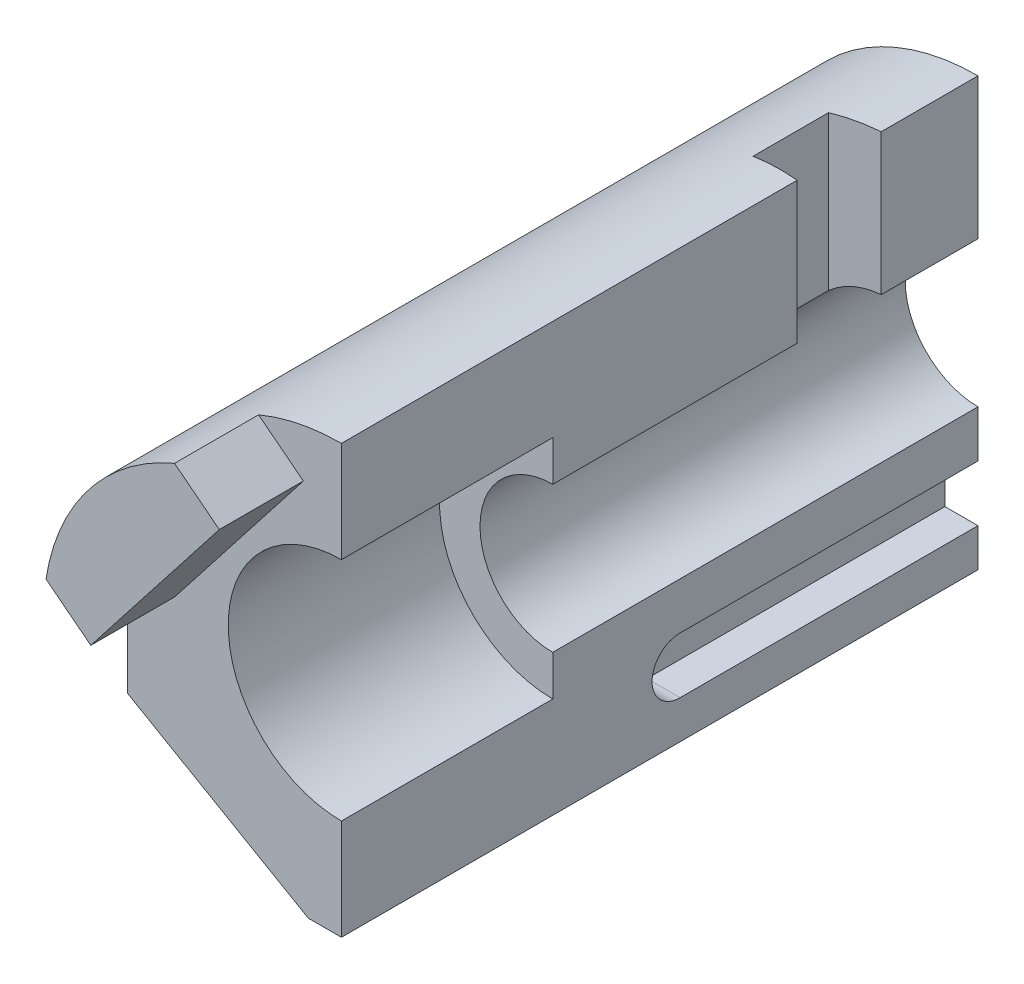
ISO-10303-21;
HEADER;
FILE_DESCRIPTION(('STEP AP214'),'2;1');
FILE_NAME('part.step','',(''),(''),'','','');
FILE_SCHEMA(('AUTOMOTIVE_DESIGN { 1 0 10303 214 1 1 1 1 }'));
ENDSEC;
DATA;
#1=APPLICATION_CONTEXT('core data for automotive mechanical design processes');
#2=APPLICATION_PROTOCOL_DEFINITION('international standard','automotive_design',2000,#1);
#3=PRODUCT_CONTEXT('',#1,'mechanical');
#4=PRODUCT('Part','Part','',(#3));
#5=PRODUCT_RELATED_PRODUCT_CATEGORY('part','',(#4));
#6=PRODUCT_DEFINITION_FORMATION('','',#4);
#7=PRODUCT_DEFINITION_CONTEXT('part definition',#1,'design');
#8=PRODUCT_DEFINITION('design','',#6,#7);
#9=PRODUCT_DEFINITION_SHAPE('','',#8);
#10=(LENGTH_UNIT() NAMED_UNIT(*) SI_UNIT(.MILLI.,.METRE.));
#11=(NAMED_UNIT(*) PLANE_ANGLE_UNIT() SI_UNIT($,.RADIAN.));
#12=(NAMED_UNIT(*) SI_UNIT($,.STERADIAN.) SOLID_ANGLE_UNIT());
#13=UNCERTAINTY_MEASURE_WITH_UNIT(LENGTH_MEASURE(1.E-05),#10,'distance_accuracy_value','');
#14=(GEOMETRIC_REPRESENTATION_CONTEXT(3) GLOBAL_UNCERTAINTY_ASSIGNED_CONTEXT((#13)) GLOBAL_UNIT_ASSIGNED_CONTEXT((#10,
#11,#12)) REPRESENTATION_CONTEXT('',''));
#15=CARTESIAN_POINT('',(0.,0.,0.));
#16=DIRECTION('',(0.,0.,1.));
#17=DIRECTION('',(1.,0.,0.));
#18=AXIS2_PLACEMENT_3D('',#15,#16,#17);
#19=CARTESIAN_POINT('',(0.,44.45,-250.));
#20=DIRECTION('',(1.,0.,0.));
#21=DIRECTION('',(0.,0.,-1.));
#22=AXIS2_PLACEMENT_3D('',#19,#20,#21);
#23=PLANE('',#22);
#24=DIRECTION('',(0.,1.,0.));
#25=VECTOR('',#24,1.);
#26=CARTESIAN_POINT('',(0.,-84.001,-212.));
#27=LINE('',#26,#25);
#28=CARTESIAN_POINT('',(0.,28.575,-212.));
#29=VERTEX_POINT('',#28);
#30=CARTESIAN_POINT('',(0.,84.,-212.));
#31=VERTEX_POINT('',#30);
#32=EDGE_CURVE('E233',#29,#31,#27,.T.);
#33=ORIENTED_EDGE('',*,*,#32,.F.);
#34=DIRECTION('',(0.,0.,-1.));
#35=VECTOR('',#34,1.);
#36=CARTESIAN_POINT('',(0.,28.575,-83.));
#37=LINE('',#36,#35);
#38=CARTESIAN_POINT('',(0.,28.575,-250.));
#39=VERTEX_POINT('',#38);
#40=EDGE_CURVE('E271',#29,#39,#37,.T.);
#41=ORIENTED_EDGE('',*,*,#40,.T.);
#42=DIRECTION('',(0.,1.,0.));
#43=VECTOR('',#42,1.);
#44=CARTESIAN_POINT('',(0.,44.45,-250.));
#45=LINE('',#44,#43);
#46=CARTESIAN_POINT('',(0.,84.,-250.));
#47=VERTEX_POINT('',#46);
#48=EDGE_CURVE('E296',#39,#47,#45,.T.);
#49=ORIENTED_EDGE('',*,*,#48,.T.);
#50=DIRECTION('',(0.,0.,1.));
#51=VECTOR('',#50,1.);
#52=CARTESIAN_POINT('',(0.,84.,-250.));
#53=LINE('',#52,#51);
#54=EDGE_CURVE('E45',#47,#31,#53,.T.);
#55=ORIENTED_EDGE('',*,*,#54,.T.);
#56=EDGE_LOOP('',(#33,#41,#49,#55));
#57=FACE_BOUND('',#56,.T.);
#58=ADVANCED_FACE('F37',(#57),#23,.T.);
#59=CARTESIAN_POINT('',(0.,0.,-250.));
#60=DIRECTION('',(0.,0.,1.));
#61=DIRECTION('',(1.,0.,0.));
#62=AXIS2_PLACEMENT_3D('',#59,#60,#61);
#63=CYLINDRICAL_SURFACE('',#62,44.45);
#64=DIRECTION('',(0.,0.,1.));
#65=VECTOR('',#64,1.);
#66=CARTESIAN_POINT('',(0.,-44.45,-250.));
#67=LINE('',#66,#65);
#68=CARTESIAN_POINT('',(0.,-44.45,-83.));
#69=VERTEX_POINT('',#68);
#70=CARTESIAN_POINT('',(0.,-44.45,0.));
#71=VERTEX_POINT('',#70);
#72=EDGE_CURVE('E324',#69,#71,#67,.T.);
#73=ORIENTED_EDGE('',*,*,#72,.F.);
#74=CARTESIAN_POINT('',(0.,0.,-83.));
#75=DIRECTION('',(0.,0.,-1.));
#76=DIRECTION('',(-1.,0.,0.));
#77=AXIS2_PLACEMENT_3D('',#74,#75,#76);
#78=CIRCLE('',#77,44.45);
#79=CARTESIAN_POINT('',(0.,44.45,-83.));
#80=VERTEX_POINT('',#79);
#81=EDGE_CURVE('E260',#69,#80,#78,.T.);
#82=ORIENTED_EDGE('',*,*,#81,.T.);
#83=DIRECTION('',(0.,0.,1.));
#84=VECTOR('',#83,1.);
#85=CARTESIAN_POINT('',(0.,44.45,-250.));
#86=LINE('',#85,#84);
#87=CARTESIAN_POINT('',(0.,44.45,0.));
#88=VERTEX_POINT('',#87);
#89=EDGE_CURVE('E322',#80,#88,#86,.T.);
#90=ORIENTED_EDGE('',*,*,#89,.T.);
#91=CARTESIAN_POINT('',(0.,0.,0.));
#92=DIRECTION('',(0.,0.,-1.));
#93=DIRECTION('',(1.,0.,0.));
#94=AXIS2_PLACEMENT_3D('',#91,#92,#93);
#95=CIRCLE('',#94,44.45);
#96=EDGE_CURVE('E314',#71,#88,#95,.T.);
#97=ORIENTED_EDGE('',*,*,#96,.F.);
#98=EDGE_LOOP('',(#73,#82,#90,#97));
#99=FACE_BOUND('',#98,.T.);
#100=ADVANCED_FACE('F368',(#99),#63,.F.);
#101=CARTESIAN_POINT('',(0.,0.,-250.));
#102=DIRECTION('',(0.,0.,1.));
#103=DIRECTION('',(1.,0.,0.));
#104=AXIS2_PLACEMENT_3D('',#101,#102,#103);
#105=CYLINDRICAL_SURFACE('',#104,84.);
#106=CARTESIAN_POINT('',(0.,0.,-212.));
#107=DIRECTION('',(-0.0871557427476552,0.,-0.996194698091746));
#108=DIRECTION('',(-0.996194698091746,0.,0.0871557427476552));
#109=AXIS2_PLACEMENT_3D('',#106,#107,#108);
#110=ELLIPSE('',#109,84.3208663536412,84.);
#111=CARTESIAN_POINT('',(-19.,81.8229796573065,-210.337715393007));
#112=VERTEX_POINT('',#111);
#113=EDGE_CURVE('E257',#31,#112,#110,.F.);
#114=ORIENTED_EDGE('',*,*,#113,.F.);
#115=ORIENTED_EDGE('',*,*,#54,.F.);
#116=CARTESIAN_POINT('',(0.,0.,-250.));
#117=DIRECTION('',(0.,0.,1.));
#118=DIRECTION('',(1.,0.,0.));
#119=AXIS2_PLACEMENT_3D('',#116,#117,#118);
#120=CIRCLE('',#119,84.);
#121=CARTESIAN_POINT('',(-84.,0.,-250.));
#122=VERTEX_POINT('',#121);
#123=EDGE_CURVE('E280',#47,#122,#120,.T.);
#124=ORIENTED_EDGE('',*,*,#123,.T.);
#125=DIRECTION('',(0.,0.,1.));
#126=VECTOR('',#125,1.);
#127=CARTESIAN_POINT('',(-84.,0.,-250.));
#128=LINE('',#127,#126);
#129=CARTESIAN_POINT('',(-84.,0.,0.));
#130=VERTEX_POINT('',#129);
#131=EDGE_CURVE('E299',#122,#130,#128,.T.);
#132=ORIENTED_EDGE('',*,*,#131,.T.);
#133=CARTESIAN_POINT('',(0.,0.,0.));
#134=DIRECTION('',(0.,0.,1.));
#135=DIRECTION('',(1.,0.,0.));
#136=AXIS2_PLACEMENT_3D('',#133,#134,#135);
#137=CIRCLE('',#136,84.);
#138=CARTESIAN_POINT('',(-83.014649379029,12.8284055313545,0.));
#139=VERTEX_POINT('',#138);
#140=EDGE_CURVE('E276',#139,#130,#137,.T.);
#141=ORIENTED_EDGE('',*,*,#140,.F.);
#142=DIRECTION('',(0.,0.,-1.));
#143=VECTOR('',#142,1.);
#144=CARTESIAN_POINT('',(-83.014649379029,12.8284055313545,33.));
#145=LINE('',#144,#143);
#146=CARTESIAN_POINT('',(-83.014649379029,12.8284055313545,33.));
#147=VERTEX_POINT('',#146);
#148=EDGE_CURVE('E230',#147,#139,#145,.T.);
#149=ORIENTED_EDGE('',*,*,#148,.F.);
#150=CARTESIAN_POINT('',(0.,0.,33.));
#151=DIRECTION('',(0.,0.,1.));
#152=DIRECTION('',(1.,0.,0.));
#153=AXIS2_PLACEMENT_3D('',#150,#151,#152);
#154=CIRCLE('',#153,84.);
#155=CARTESIAN_POINT('',(-32.5304084023249,77.4452873271056,33.));
#156=VERTEX_POINT('',#155);
#157=EDGE_CURVE('E205',#156,#147,#154,.T.);
#158=ORIENTED_EDGE('',*,*,#157,.F.);
#159=DIRECTION('',(0.,0.,-1.));
#160=VECTOR('',#159,1.);
#161=CARTESIAN_POINT('',(-32.5304084023249,77.4452873271056,33.));
#162=LINE('',#161,#160);
#163=CARTESIAN_POINT('',(-32.5304084023249,77.4452873271056,0.));
#164=VERTEX_POINT('',#163);
#165=EDGE_CURVE('E214',#156,#164,#162,.T.);
#166=ORIENTED_EDGE('',*,*,#165,.T.);
#167=CARTESIAN_POINT('',(0.,84.,0.));
#168=VERTEX_POINT('',#167);
#169=EDGE_CURVE('E300',#168,#164,#137,.T.);
#170=ORIENTED_EDGE('',*,*,#169,.F.);
#171=CARTESIAN_POINT('',(0.,84.,-179.));
#172=VERTEX_POINT('',#171);
#173=EDGE_CURVE('E321',#172,#168,#53,.T.);
#174=ORIENTED_EDGE('',*,*,#173,.F.);
#175=CARTESIAN_POINT('',(0.,0.,-179.));
#176=DIRECTION('',(-0.0871557427476537,0.,0.996194698091746));
#177=DIRECTION('',(0.996194698091746,0.,0.0871557427476537));
#178=AXIS2_PLACEMENT_3D('',#175,#176,#177);
#179=ELLIPSE('',#178,84.3208663536412,84.);
#180=CARTESIAN_POINT('',(-19.,81.8229796573065,-180.662284606992));
#181=VERTEX_POINT('',#180);
#182=EDGE_CURVE('E242',#181,#172,#179,.F.);
#183=ORIENTED_EDGE('',*,*,#182,.F.);
#184=DIRECTION('',(0.,0.,1.));
#185=VECTOR('',#184,1.);
#186=CARTESIAN_POINT('',(-19.,81.8229796573065,-250.));
#187=LINE('',#186,#185);
#188=EDGE_CURVE('E255',#112,#181,#187,.T.);
#189=ORIENTED_EDGE('',*,*,#188,.F.);
#190=EDGE_LOOP('',(#114,#115,#124,#132,#141,#149,#158,#166,#170,#174,#183,#189));
#191=FACE_BOUND('',#190,.T.);
#192=ADVANCED_FACE('F39',(#191),#105,.T.);
#193=DIRECTION('',(0.,1.,0.));
#194=VECTOR('',#193,1.);
#195=CARTESIAN_POINT('',(0.,-84.001,-179.));
#196=LINE('',#195,#194);
#197=CARTESIAN_POINT('',(0.,28.575,-179.));
#198=VERTEX_POINT('',#197);
#199=EDGE_CURVE('E239',#198,#172,#196,.T.);
#200=ORIENTED_EDGE('',*,*,#199,.T.);
#201=ORIENTED_EDGE('',*,*,#173,.T.);
#202=DIRECTION('',(0.,1.,0.));
#203=VECTOR('',#202,1.);
#204=CARTESIAN_POINT('',(0.,44.45,0.));
#205=LINE('',#204,#203);
#206=EDGE_CURVE('E284',#88,#168,#205,.T.);
#207=ORIENTED_EDGE('',*,*,#206,.F.);
#208=ORIENTED_EDGE('',*,*,#89,.F.);
#209=DIRECTION('',(0.,-1.,0.));
#210=VECTOR('',#209,1.);
#211=CARTESIAN_POINT('',(0.,28.575,-83.));
#212=LINE('',#211,#210);
#213=CARTESIAN_POINT('',(0.,28.575,-83.));
#214=VERTEX_POINT('',#213);
#215=EDGE_CURVE('E262',#80,#214,#212,.T.);
#216=ORIENTED_EDGE('',*,*,#215,.T.);
#217=EDGE_CURVE('E277',#214,#198,#37,.T.);
#218=ORIENTED_EDGE('',*,*,#217,.T.);
#219=EDGE_LOOP('',(#200,#201,#207,#208,#216,#218));
#220=FACE_BOUND('',#219,.T.);
#221=ADVANCED_FACE('F371',(#220),#23,.T.);
#222=CARTESIAN_POINT('',(0.,-84.,-250.));
#223=DIRECTION('',(1.,0.,0.));
#224=DIRECTION('',(0.,0.,-1.));
#225=AXIS2_PLACEMENT_3D('',#222,#223,#224);
#226=PLANE('',#225);
#227=DIRECTION('',(0.,0.,-1.));
#228=VECTOR('',#227,1.);
#229=CARTESIAN_POINT('',(0.,-69.,-250.));
#230=LINE('',#229,#228);
#231=CARTESIAN_POINT('',(0.,-69.,-133.));
#232=VERTEX_POINT('',#231);
#233=CARTESIAN_POINT('',(0.,-69.,-250.));
#234=VERTEX_POINT('',#233);
#235=EDGE_CURVE('E193',#232,#234,#230,.T.);
#236=ORIENTED_EDGE('',*,*,#235,.F.);
#237=CARTESIAN_POINT('',(0.,-58.,-133.));
#238=DIRECTION('',(1.,0.,0.));
#239=DIRECTION('',(0.,0.,-1.));
#240=AXIS2_PLACEMENT_3D('',#237,#238,#239);
#241=CIRCLE('',#240,11.);
#242=CARTESIAN_POINT('',(0.,-47.,-133.));
#243=VERTEX_POINT('',#242);
#244=EDGE_CURVE('E425',#243,#232,#241,.T.);
#245=ORIENTED_EDGE('',*,*,#244,.F.);
#246=DIRECTION('',(0.,0.,1.));
#247=VECTOR('',#246,1.);
#248=CARTESIAN_POINT('',(0.,-47.,-250.));
#249=LINE('',#248,#247);
#250=CARTESIAN_POINT('',(0.,-47.,-250.));
#251=VERTEX_POINT('',#250);
#252=EDGE_CURVE('E423',#251,#243,#249,.T.);
#253=ORIENTED_EDGE('',*,*,#252,.F.);
#254=DIRECTION('',(0.,1.,0.));
#255=VECTOR('',#254,1.);
#256=CARTESIAN_POINT('',(0.,-84.,-250.));
#257=LINE('',#256,#255);
#258=CARTESIAN_POINT('',(0.,-28.575,-250.));
#259=VERTEX_POINT('',#258);
#260=EDGE_CURVE('E198',#251,#259,#257,.T.);
#261=ORIENTED_EDGE('',*,*,#260,.T.);
#262=DIRECTION('',(0.,0.,-1.));
#263=VECTOR('',#262,1.);
#264=CARTESIAN_POINT('',(0.,-28.575,-83.));
#265=LINE('',#264,#263);
#266=CARTESIAN_POINT('',(0.,-28.575,-83.));
#267=VERTEX_POINT('',#266);
#268=EDGE_CURVE('E273',#267,#259,#265,.T.);
#269=ORIENTED_EDGE('',*,*,#268,.F.);
#270=DIRECTION('',(0.,-1.,0.));
#271=VECTOR('',#270,1.);
#272=CARTESIAN_POINT('',(0.,-28.575,-83.));
#273=LINE('',#272,#271);
#274=EDGE_CURVE('E268',#267,#69,#273,.T.);
#275=ORIENTED_EDGE('',*,*,#274,.T.);
#276=ORIENTED_EDGE('',*,*,#72,.T.);
#277=DIRECTION('',(0.,1.,0.));
#278=VECTOR('',#277,1.);
#279=CARTESIAN_POINT('',(0.,-84.,0.));
#280=LINE('',#279,#278);
#281=CARTESIAN_POINT('',(0.,-84.,0.));
#282=VERTEX_POINT('',#281);
#283=EDGE_CURVE('E311',#282,#71,#280,.T.);
#284=ORIENTED_EDGE('',*,*,#283,.F.);
#285=DIRECTION('',(0.,0.,1.));
#286=VECTOR('',#285,1.);
#287=CARTESIAN_POINT('',(0.,-84.,-250.));
#288=LINE('',#287,#286);
#289=CARTESIAN_POINT('',(0.,-84.,-250.));
#290=VERTEX_POINT('',#289);
#291=EDGE_CURVE('E326',#290,#282,#288,.T.);
#292=ORIENTED_EDGE('',*,*,#291,.F.);
#293=EDGE_CURVE('E293',#290,#234,#257,.T.);
#294=ORIENTED_EDGE('',*,*,#293,.T.);
#295=EDGE_LOOP('',(#236,#245,#253,#261,#269,#275,#276,#284,#292,#294));
#296=FACE_BOUND('',#295,.T.);
#297=ADVANCED_FACE('F380',(#296),#226,.T.);
#298=CARTESIAN_POINT('',(-13.,-84.,-250.));
#299=DIRECTION('',(0.,-1.,0.));
#300=DIRECTION('',(0.,0.,-1.));
#301=AXIS2_PLACEMENT_3D('',#298,#299,#300);
#302=PLANE('',#301);
#303=DIRECTION('',(1.,0.,0.));
#304=VECTOR('',#303,1.);
#305=CARTESIAN_POINT('',(-13.,-84.,0.));
#306=LINE('',#305,#304);
#307=CARTESIAN_POINT('',(-13.,-84.,0.));
#308=VERTEX_POINT('',#307);
#309=EDGE_CURVE('E308',#308,#282,#306,.T.);
#310=ORIENTED_EDGE('',*,*,#309,.F.);
#311=DIRECTION('',(0.,0.,1.));
#312=VECTOR('',#311,1.);
#313=CARTESIAN_POINT('',(-13.,-84.,-250.));
#314=LINE('',#313,#312);
#315=CARTESIAN_POINT('',(-13.,-84.,-250.));
#316=VERTEX_POINT('',#315);
#317=EDGE_CURVE('E328',#316,#308,#314,.T.);
#318=ORIENTED_EDGE('',*,*,#317,.F.);
#319=DIRECTION('',(1.,0.,0.));
#320=VECTOR('',#319,1.);
#321=CARTESIAN_POINT('',(-13.,-84.,-250.));
#322=LINE('',#321,#320);
#323=EDGE_CURVE('E290',#316,#290,#322,.T.);
#324=ORIENTED_EDGE('',*,*,#323,.T.);
#325=ORIENTED_EDGE('',*,*,#291,.T.);
#326=EDGE_LOOP('',(#310,#318,#324,#325));
#327=FACE_BOUND('',#326,.T.);
#328=ADVANCED_FACE('F386',(#327),#302,.T.);
#329=CARTESIAN_POINT('',(-84.,-43.0081308875365,-250.));
#330=DIRECTION('',(-0.500000000000001,-0.866025403784438,0.));
#331=DIRECTION('',(0.866025403784438,-0.500000000000001,0.));
#332=AXIS2_PLACEMENT_3D('',#329,#330,#331);
#333=PLANE('',#332);
#334=DIRECTION('',(0.866025403784438,-0.500000000000001,0.));
#335=VECTOR('',#334,1.);
#336=CARTESIAN_POINT('',(-84.,-43.0081308875365,0.));
#337=LINE('',#336,#335);
#338=CARTESIAN_POINT('',(-84.,-43.0081308875365,0.));
#339=VERTEX_POINT('',#338);
#340=EDGE_CURVE('E305',#339,#308,#337,.T.);
#341=ORIENTED_EDGE('',*,*,#340,.F.);
#342=DIRECTION('',(0.,0.,1.));
#343=VECTOR('',#342,1.);
#344=CARTESIAN_POINT('',(-84.,-43.0081308875365,-250.));
#345=LINE('',#344,#343);
#346=CARTESIAN_POINT('',(-84.,-43.0081308875365,-250.));
#347=VERTEX_POINT('',#346);
#348=EDGE_CURVE('E330',#347,#339,#345,.T.);
#349=ORIENTED_EDGE('',*,*,#348,.F.);
#350=DIRECTION('',(0.866025403784438,-0.500000000000001,0.));
#351=VECTOR('',#350,1.);
#352=CARTESIAN_POINT('',(-84.,-43.0081308875365,-250.));
#353=LINE('',#352,#351);
#354=EDGE_CURVE('E287',#347,#316,#353,.T.);
#355=ORIENTED_EDGE('',*,*,#354,.T.);
#356=ORIENTED_EDGE('',*,*,#317,.T.);
#357=EDGE_LOOP('',(#341,#349,#355,#356));
#358=FACE_BOUND('',#357,.T.);
#359=ADVANCED_FACE('F409',(#358),#333,.T.);
#360=CARTESIAN_POINT('',(-84.,0.,-250.));
#361=DIRECTION('',(-1.,0.,0.));
#362=DIRECTION('',(0.,0.,1.));
#363=AXIS2_PLACEMENT_3D('',#360,#361,#362);
#364=PLANE('',#363);
#365=DIRECTION('',(0.,-1.,0.));
#366=VECTOR('',#365,1.);
#367=CARTESIAN_POINT('',(-84.,0.,0.));
#368=LINE('',#367,#366);
#369=EDGE_CURVE('E302',#130,#339,#368,.T.);
#370=ORIENTED_EDGE('',*,*,#369,.F.);
#371=ORIENTED_EDGE('',*,*,#131,.F.);
#372=DIRECTION('',(0.,-1.,0.));
#373=VECTOR('',#372,1.);
#374=CARTESIAN_POINT('',(-84.,0.,-250.));
#375=LINE('',#374,#373);
#376=EDGE_CURVE('E283',#122,#347,#375,.T.);
#377=ORIENTED_EDGE('',*,*,#376,.T.);
#378=ORIENTED_EDGE('',*,*,#348,.T.);
#379=EDGE_LOOP('',(#370,#371,#377,#378));
#380=FACE_BOUND('',#379,.T.);
#381=ADVANCED_FACE('F340',(#380),#364,.T.);
#382=CARTESIAN_POINT('',(0.,0.,-250.));
#383=DIRECTION('',(0.,0.,1.));
#384=DIRECTION('',(1.,0.,0.));
#385=AXIS2_PLACEMENT_3D('',#382,#383,#384);
#386=PLANE('',#385);
#387=DIRECTION('',(0.,1.,0.));
#388=VECTOR('',#387,1.);
#389=CARTESIAN_POINT('',(-13.,0.,-250.));
#390=LINE('',#389,#388);
#391=CARTESIAN_POINT('',(-13.,-69.,-250.));
#392=VERTEX_POINT('',#391);
#393=CARTESIAN_POINT('',(-13.,-47.,-250.));
#394=VERTEX_POINT('',#393);
#395=EDGE_CURVE('E11',#392,#394,#390,.T.);
#396=ORIENTED_EDGE('',*,*,#395,.F.);
#397=DIRECTION('',(1.,0.,0.));
#398=VECTOR('',#397,1.);
#399=CARTESIAN_POINT('',(-13.,-69.,-250.));
#400=LINE('',#399,#398);
#401=EDGE_CURVE('E219',#392,#234,#400,.T.);
#402=ORIENTED_EDGE('',*,*,#401,.T.);
#403=ORIENTED_EDGE('',*,*,#293,.F.);
#404=ORIENTED_EDGE('',*,*,#323,.F.);
#405=ORIENTED_EDGE('',*,*,#354,.F.);
#406=ORIENTED_EDGE('',*,*,#376,.F.);
#407=ORIENTED_EDGE('',*,*,#123,.F.);
#408=ORIENTED_EDGE('',*,*,#48,.F.);
#409=CARTESIAN_POINT('',(0.,0.,-250.));
#410=DIRECTION('',(0.,0.,1.));
#411=DIRECTION('',(1.,0.,0.));
#412=AXIS2_PLACEMENT_3D('',#409,#410,#411);
#413=CIRCLE('',#412,28.575);
#414=EDGE_CURVE('E259',#39,#259,#413,.T.);
#415=ORIENTED_EDGE('',*,*,#414,.T.);
#416=ORIENTED_EDGE('',*,*,#260,.F.);
#417=DIRECTION('',(1.,0.,0.));
#418=VECTOR('',#417,1.);
#419=CARTESIAN_POINT('',(-13.,-47.,-250.));
#420=LINE('',#419,#418);
#421=EDGE_CURVE('E188',#394,#251,#420,.T.);
#422=ORIENTED_EDGE('',*,*,#421,.F.);
#423=EDGE_LOOP('',(#396,#402,#403,#404,#405,#406,#407,#408,#415,#416,#422));
#424=FACE_BOUND('',#423,.T.);
#425=ADVANCED_FACE('F196',(#424),#386,.F.);
#426=CARTESIAN_POINT('',(0.,0.,0.));
#427=DIRECTION('',(0.,0.,1.));
#428=DIRECTION('',(1.,0.,0.));
#429=AXIS2_PLACEMENT_3D('',#426,#427,#428);
#430=PLANE('',#429);
#431=DIRECTION('',(-0.788010753606721,0.615661475325659,0.));
#432=VECTOR('',#431,1.);
#433=CARTESIAN_POINT('',(-14.9464279455908,63.7071761394842,0.));
#434=LINE('',#433,#432);
#435=CARTESIAN_POINT('',(-14.9464279455908,63.7071761394842,0.));
#436=VERTEX_POINT('',#435);
#437=EDGE_CURVE('E59',#436,#164,#434,.T.);
#438=ORIENTED_EDGE('',*,*,#437,.F.);
#439=DIRECTION('',(0.615661475325659,0.788010753606722,0.));
#440=VECTOR('',#439,1.);
#441=CARTESIAN_POINT('',(-65.4306689222948,-0.909705656266953,0.));
#442=LINE('',#441,#440);
#443=CARTESIAN_POINT('',(-65.4306689222948,-0.909705656266953,0.));
#444=VERTEX_POINT('',#443);
#445=EDGE_CURVE('E218',#444,#436,#442,.T.);
#446=ORIENTED_EDGE('',*,*,#445,.F.);
#447=DIRECTION('',(0.788010753606722,-0.615661475325659,0.));
#448=VECTOR('',#447,1.);
#449=CARTESIAN_POINT('',(-83.014649379029,12.8284055313545,0.));
#450=LINE('',#449,#448);
#451=EDGE_CURVE('E215',#139,#444,#450,.T.);
#452=ORIENTED_EDGE('',*,*,#451,.F.);
#453=ORIENTED_EDGE('',*,*,#140,.T.);
#454=ORIENTED_EDGE('',*,*,#369,.T.);
#455=ORIENTED_EDGE('',*,*,#340,.T.);
#456=ORIENTED_EDGE('',*,*,#309,.T.);
#457=ORIENTED_EDGE('',*,*,#283,.T.);
#458=ORIENTED_EDGE('',*,*,#96,.T.);
#459=ORIENTED_EDGE('',*,*,#206,.T.);
#460=ORIENTED_EDGE('',*,*,#169,.T.);
#461=EDGE_LOOP('',(#438,#446,#452,#453,#454,#455,#456,#457,#458,#459,#460));
#462=FACE_BOUND('',#461,.T.);
#463=ADVANCED_FACE('F342',(#462),#430,.T.);
#464=CARTESIAN_POINT('',(0.,0.,-83.));
#465=DIRECTION('',(0.,0.,-1.));
#466=DIRECTION('',(-1.,0.,0.));
#467=AXIS2_PLACEMENT_3D('',#464,#465,#466);
#468=CYLINDRICAL_SURFACE('',#467,28.575);
#469=CARTESIAN_POINT('',(0.,0.,-212.));
#470=DIRECTION('',(-0.0871557427476552,0.,-0.996194698091746));
#471=DIRECTION('',(0.996194698091746,0.,-0.0871557427476552));
#472=AXIS2_PLACEMENT_3D('',#469,#470,#471);
#473=ELLIPSE('',#472,28.6841518578011,28.575);
#474=CARTESIAN_POINT('',(-19.,21.3431634253219,-210.337715393007));
#475=VERTEX_POINT('',#474);
#476=EDGE_CURVE('E250',#29,#475,#473,.F.);
#477=ORIENTED_EDGE('',*,*,#476,.T.);
#478=DIRECTION('',(0.,0.,-1.));
#479=VECTOR('',#478,1.);
#480=CARTESIAN_POINT('',(-19.,21.3431634253219,-83.));
#481=LINE('',#480,#479);
#482=CARTESIAN_POINT('',(-19.,21.3431634253219,-180.662284606992));
#483=VERTEX_POINT('',#482);
#484=EDGE_CURVE('E234',#475,#483,#481,.F.);
#485=ORIENTED_EDGE('',*,*,#484,.T.);
#486=CARTESIAN_POINT('',(0.,0.,-179.));
#487=DIRECTION('',(-0.0871557427476537,0.,0.996194698091746));
#488=DIRECTION('',(-0.996194698091746,0.,-0.0871557427476537));
#489=AXIS2_PLACEMENT_3D('',#486,#487,#488);
#490=ELLIPSE('',#489,28.6841518578011,28.575);
#491=EDGE_CURVE('E243',#483,#198,#490,.F.);
#492=ORIENTED_EDGE('',*,*,#491,.T.);
#493=ORIENTED_EDGE('',*,*,#217,.F.);
#494=CARTESIAN_POINT('',(0.,0.,-83.));
#495=DIRECTION('',(0.,0.,1.));
#496=DIRECTION('',(1.,0.,0.));
#497=AXIS2_PLACEMENT_3D('',#494,#495,#496);
#498=CIRCLE('',#497,28.575);
#499=EDGE_CURVE('E265',#214,#267,#498,.T.);
#500=ORIENTED_EDGE('',*,*,#499,.T.);
#501=ORIENTED_EDGE('',*,*,#268,.T.);
#502=ORIENTED_EDGE('',*,*,#414,.F.);
#503=ORIENTED_EDGE('',*,*,#40,.F.);
#504=EDGE_LOOP('',(#477,#485,#492,#493,#500,#501,#502,#503));
#505=FACE_BOUND('',#504,.T.);
#506=ADVANCED_FACE('F399',(#505),#468,.F.);
#507=CARTESIAN_POINT('',(0.,0.,-83.));
#508=DIRECTION('',(0.,0.,-1.));
#509=DIRECTION('',(-1.,0.,0.));
#510=AXIS2_PLACEMENT_3D('',#507,#508,#509);
#511=PLANE('',#510);
#512=ORIENTED_EDGE('',*,*,#81,.F.);
#513=ORIENTED_EDGE('',*,*,#274,.F.);
#514=ORIENTED_EDGE('',*,*,#499,.F.);
#515=ORIENTED_EDGE('',*,*,#215,.F.);
#516=EDGE_LOOP('',(#512,#513,#514,#515));
#517=FACE_BOUND('',#516,.T.);
#518=ADVANCED_FACE('F421',(#517),#511,.F.);
#519=CARTESIAN_POINT('',(-19.,-84.001,-210.337715393007));
#520=DIRECTION('',(-0.0871557427476552,0.,-0.996194698091746));
#521=DIRECTION('',(-0.996194698091746,0.,0.0871557427476552));
#522=AXIS2_PLACEMENT_3D('',#519,#520,#521);
#523=PLANE('',#522);
#524=ORIENTED_EDGE('',*,*,#113,.T.);
#525=DIRECTION('',(0.,1.,0.));
#526=VECTOR('',#525,1.);
#527=CARTESIAN_POINT('',(-19.,-84.001,-210.337715393007));
#528=LINE('',#527,#526);
#529=EDGE_CURVE('E238',#475,#112,#528,.T.);
#530=ORIENTED_EDGE('',*,*,#529,.F.);
#531=ORIENTED_EDGE('',*,*,#476,.F.);
#532=ORIENTED_EDGE('',*,*,#32,.T.);
#533=EDGE_LOOP('',(#524,#530,#531,#532));
#534=FACE_BOUND('',#533,.T.);
#535=ADVANCED_FACE('F403',(#534),#523,.F.);
#536=CARTESIAN_POINT('',(-19.,-84.001,-180.662284606992));
#537=DIRECTION('',(-1.,0.,0.));
#538=DIRECTION('',(0.,0.,1.));
#539=AXIS2_PLACEMENT_3D('',#536,#537,#538);
#540=PLANE('',#539);
#541=ORIENTED_EDGE('',*,*,#188,.T.);
#542=DIRECTION('',(0.,1.,0.));
#543=VECTOR('',#542,1.);
#544=CARTESIAN_POINT('',(-19.,-84.001,-180.662284606992));
#545=LINE('',#544,#543);
#546=EDGE_CURVE('E237',#483,#181,#545,.T.);
#547=ORIENTED_EDGE('',*,*,#546,.F.);
#548=ORIENTED_EDGE('',*,*,#484,.F.);
#549=ORIENTED_EDGE('',*,*,#529,.T.);
#550=EDGE_LOOP('',(#541,#547,#548,#549));
#551=FACE_BOUND('',#550,.T.);
#552=ADVANCED_FACE('F396',(#551),#540,.F.);
#553=CARTESIAN_POINT('',(0.,-84.001,-179.));
#554=DIRECTION('',(-0.0871557427476537,0.,0.996194698091746));
#555=DIRECTION('',(0.996194698091746,0.,0.0871557427476537));
#556=AXIS2_PLACEMENT_3D('',#553,#554,#555);
#557=PLANE('',#556);
#558=ORIENTED_EDGE('',*,*,#182,.T.);
#559=ORIENTED_EDGE('',*,*,#199,.F.);
#560=ORIENTED_EDGE('',*,*,#491,.F.);
#561=ORIENTED_EDGE('',*,*,#546,.T.);
#562=EDGE_LOOP('',(#558,#559,#560,#561));
#563=FACE_BOUND('',#562,.T.);
#564=ADVANCED_FACE('F393',(#563),#557,.F.);
#565=CARTESIAN_POINT('',(-83.014649379029,12.8284055313545,33.));
#566=DIRECTION('',(0.615661475325659,0.788010753606722,0.));
#567=DIRECTION('',(-0.788010753606722,0.615661475325659,0.));
#568=AXIS2_PLACEMENT_3D('',#565,#566,#567);
#569=PLANE('',#568);
#570=ORIENTED_EDGE('',*,*,#451,.T.);
#571=DIRECTION('',(0.,0.,-1.));
#572=VECTOR('',#571,1.);
#573=CARTESIAN_POINT('',(-65.4306689222948,-0.909705656266953,33.));
#574=LINE('',#573,#572);
#575=CARTESIAN_POINT('',(-65.4306689222948,-0.909705656266953,33.));
#576=VERTEX_POINT('',#575);
#577=EDGE_CURVE('E227',#576,#444,#574,.T.);
#578=ORIENTED_EDGE('',*,*,#577,.F.);
#579=DIRECTION('',(0.788010753606722,-0.615661475325659,0.));
#580=VECTOR('',#579,1.);
#581=CARTESIAN_POINT('',(-83.014649379029,12.8284055313545,33.));
#582=LINE('',#581,#580);
#583=EDGE_CURVE('E208',#147,#576,#582,.T.);
#584=ORIENTED_EDGE('',*,*,#583,.F.);
#585=ORIENTED_EDGE('',*,*,#148,.T.);
#586=EDGE_LOOP('',(#570,#578,#584,#585));
#587=FACE_BOUND('',#586,.T.);
#588=ADVANCED_FACE('F345',(#587),#569,.F.);
#589=CARTESIAN_POINT('',(-65.4306689222948,-0.909705656266953,33.));
#590=DIRECTION('',(-0.788010753606721,0.615661475325659,0.));
#591=DIRECTION('',(-0.615661475325659,-0.788010753606722,0.));
#592=AXIS2_PLACEMENT_3D('',#589,#590,#591);
#593=PLANE('',#592);
#594=ORIENTED_EDGE('',*,*,#445,.T.);
#595=DIRECTION('',(0.,0.,-1.));
#596=VECTOR('',#595,1.);
#597=CARTESIAN_POINT('',(-14.9464279455908,63.7071761394842,33.));
#598=LINE('',#597,#596);
#599=CARTESIAN_POINT('',(-14.9464279455908,63.7071761394842,33.));
#600=VERTEX_POINT('',#599);
#601=EDGE_CURVE('E224',#600,#436,#598,.T.);
#602=ORIENTED_EDGE('',*,*,#601,.F.);
#603=DIRECTION('',(0.615661475325659,0.788010753606722,0.));
#604=VECTOR('',#603,1.);
#605=CARTESIAN_POINT('',(-65.4306689222948,-0.909705656266953,33.));
#606=LINE('',#605,#604);
#607=EDGE_CURVE('E210',#576,#600,#606,.T.);
#608=ORIENTED_EDGE('',*,*,#607,.F.);
#609=ORIENTED_EDGE('',*,*,#577,.T.);
#610=EDGE_LOOP('',(#594,#602,#608,#609));
#611=FACE_BOUND('',#610,.T.);
#612=ADVANCED_FACE('F348',(#611),#593,.F.);
#613=CARTESIAN_POINT('',(-14.9464279455908,63.7071761394842,33.));
#614=DIRECTION('',(-0.615661475325659,-0.788010753606721,0.));
#615=DIRECTION('',(0.788010753606721,-0.615661475325659,0.));
#616=AXIS2_PLACEMENT_3D('',#613,#614,#615);
#617=PLANE('',#616);
#618=ORIENTED_EDGE('',*,*,#437,.T.);
#619=ORIENTED_EDGE('',*,*,#165,.F.);
#620=DIRECTION('',(-0.788010753606721,0.615661475325659,0.));
#621=VECTOR('',#620,1.);
#622=CARTESIAN_POINT('',(-14.9464279455908,63.7071761394842,33.));
#623=LINE('',#622,#621);
#624=EDGE_CURVE('E212',#600,#156,#623,.T.);
#625=ORIENTED_EDGE('',*,*,#624,.F.);
#626=ORIENTED_EDGE('',*,*,#601,.T.);
#627=EDGE_LOOP('',(#618,#619,#625,#626));
#628=FACE_BOUND('',#627,.T.);
#629=ADVANCED_FACE('F358',(#628),#617,.F.);
#630=CARTESIAN_POINT('',(0.,0.,33.));
#631=DIRECTION('',(0.,0.,1.));
#632=DIRECTION('',(1.,0.,0.));
#633=AXIS2_PLACEMENT_3D('',#630,#631,#632);
#634=PLANE('',#633);
#635=ORIENTED_EDGE('',*,*,#157,.T.);
#636=ORIENTED_EDGE('',*,*,#583,.T.);
#637=ORIENTED_EDGE('',*,*,#607,.T.);
#638=ORIENTED_EDGE('',*,*,#624,.T.);
#639=EDGE_LOOP('',(#635,#636,#637,#638));
#640=FACE_BOUND('',#639,.T.);
#641=ADVANCED_FACE('F352',(#640),#634,.T.);
#642=CARTESIAN_POINT('',(-13.,-58.,-250.));
#643=DIRECTION('',(1.,0.,0.));
#644=DIRECTION('',(0.,0.,-1.));
#645=AXIS2_PLACEMENT_3D('',#642,#643,#644);
#646=PLANE('',#645);
#647=ORIENTED_EDGE('',*,*,#395,.T.);
#648=DIRECTION('',(0.,0.,1.));
#649=VECTOR('',#648,1.);
#650=CARTESIAN_POINT('',(-13.,-47.,-250.));
#651=LINE('',#650,#649);
#652=CARTESIAN_POINT('',(-13.,-47.,-133.));
#653=VERTEX_POINT('',#652);
#654=EDGE_CURVE('E181',#394,#653,#651,.T.);
#655=ORIENTED_EDGE('',*,*,#654,.T.);
#656=CARTESIAN_POINT('',(-13.,-58.,-133.));
#657=DIRECTION('',(1.,0.,0.));
#658=DIRECTION('',(0.,0.,-1.));
#659=AXIS2_PLACEMENT_3D('',#656,#657,#658);
#660=CIRCLE('',#659,11.);
#661=CARTESIAN_POINT('',(-13.,-69.,-133.));
#662=VERTEX_POINT('',#661);
#663=EDGE_CURVE('E192',#653,#662,#660,.T.);
#664=ORIENTED_EDGE('',*,*,#663,.T.);
#665=DIRECTION('',(0.,0.,-1.));
#666=VECTOR('',#665,1.);
#667=CARTESIAN_POINT('',(-13.,-69.,-250.));
#668=LINE('',#667,#666);
#669=EDGE_CURVE('E51',#662,#392,#668,.T.);
#670=ORIENTED_EDGE('',*,*,#669,.T.);
#671=EDGE_LOOP('',(#647,#655,#664,#670));
#672=FACE_BOUND('',#671,.T.);
#673=ADVANCED_FACE('F180',(#672),#646,.T.);
#674=CARTESIAN_POINT('',(-13.,-69.,-250.));
#675=DIRECTION('',(0.,-1.,0.));
#676=DIRECTION('',(0.,0.,-1.));
#677=AXIS2_PLACEMENT_3D('',#674,#675,#676);
#678=PLANE('',#677);
#679=ORIENTED_EDGE('',*,*,#235,.T.);
#680=ORIENTED_EDGE('',*,*,#401,.F.);
#681=ORIENTED_EDGE('',*,*,#669,.F.);
#682=DIRECTION('',(1.,0.,0.));
#683=VECTOR('',#682,1.);
#684=CARTESIAN_POINT('',(-13.,-69.,-133.));
#685=LINE('',#684,#683);
#686=EDGE_CURVE('E200',#662,#232,#685,.T.);
#687=ORIENTED_EDGE('',*,*,#686,.T.);
#688=EDGE_LOOP('',(#679,#680,#681,#687));
#689=FACE_BOUND('',#688,.T.);
#690=ADVANCED_FACE('F432',(#689),#678,.F.);
#691=CARTESIAN_POINT('',(-13.,-58.,-133.));
#692=DIRECTION('',(1.,0.,0.));
#693=DIRECTION('',(0.,0.,-1.));
#694=AXIS2_PLACEMENT_3D('',#691,#692,#693);
#695=CYLINDRICAL_SURFACE('',#694,11.);
#696=ORIENTED_EDGE('',*,*,#244,.T.);
#697=ORIENTED_EDGE('',*,*,#686,.F.);
#698=ORIENTED_EDGE('',*,*,#663,.F.);
#699=DIRECTION('',(1.,0.,0.));
#700=VECTOR('',#699,1.);
#701=CARTESIAN_POINT('',(-13.,-47.,-133.));
#702=LINE('',#701,#700);
#703=EDGE_CURVE('E190',#653,#243,#702,.T.);
#704=ORIENTED_EDGE('',*,*,#703,.T.);
#705=EDGE_LOOP('',(#696,#697,#698,#704));
#706=FACE_BOUND('',#705,.T.);
#707=ADVANCED_FACE('F434',(#706),#695,.F.);
#708=CARTESIAN_POINT('',(-13.,-47.,-250.));
#709=DIRECTION('',(0.,1.,0.));
#710=DIRECTION('',(0.,0.,1.));
#711=AXIS2_PLACEMENT_3D('',#708,#709,#710);
#712=PLANE('',#711);
#713=ORIENTED_EDGE('',*,*,#252,.T.);
#714=ORIENTED_EDGE('',*,*,#703,.F.);
#715=ORIENTED_EDGE('',*,*,#654,.F.);
#716=ORIENTED_EDGE('',*,*,#421,.T.);
#717=EDGE_LOOP('',(#713,#714,#715,#716));
#718=FACE_BOUND('',#717,.T.);
#719=ADVANCED_FACE('F187',(#718),#712,.F.);
#720=CLOSED_SHELL('',(#58,#100,#192,#221,#297,#328,#359,#381,#425,#463,#506,#518,#535,#552,#564,
#588,#612,#629,#641,#673,#690,#707,#719));
#721=MANIFOLD_SOLID_BREP('B2',#720);
#722=ADVANCED_BREP_SHAPE_REPRESENTATION('',(#18,#721),#14);
#723=SHAPE_DEFINITION_REPRESENTATION(#9,#722);
ENDSEC;
END-ISO-10303-21;
